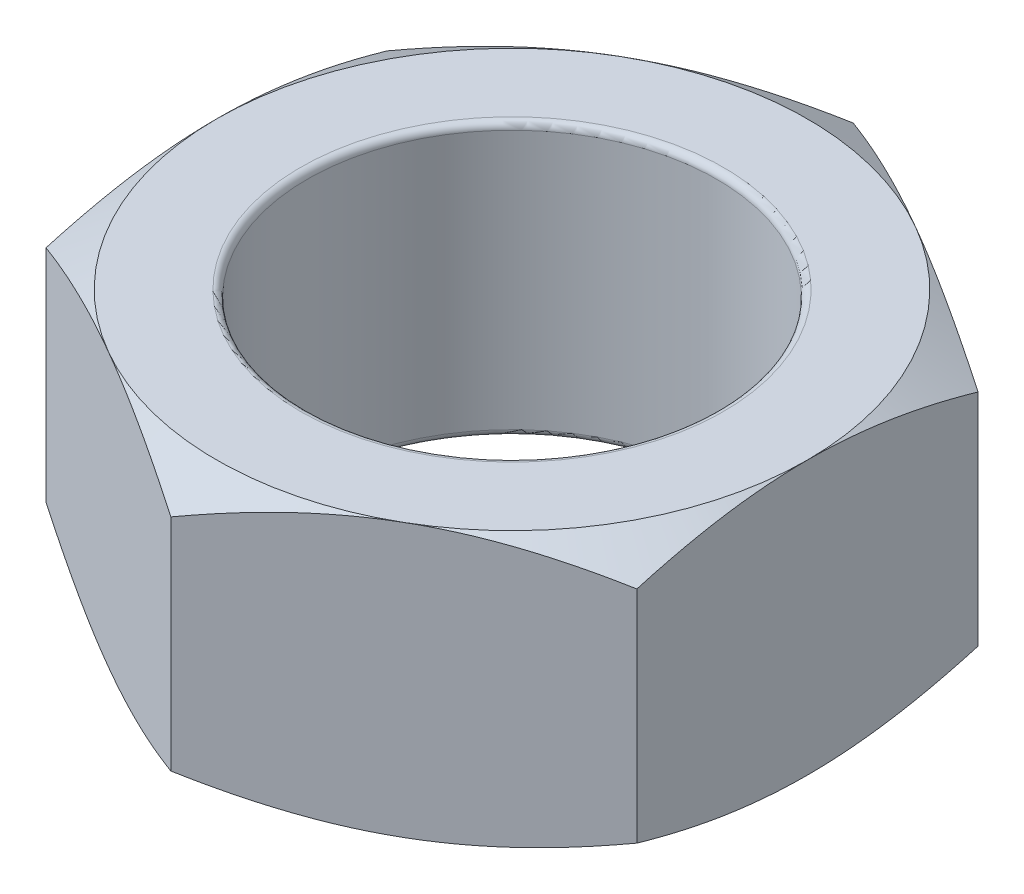
ISO-10303-21;
HEADER;
FILE_DESCRIPTION(('STEP AP214'),'2;1');
FILE_NAME('part.step','',(''),(''),'','','');
FILE_SCHEMA(('AUTOMOTIVE_DESIGN { 1 0 10303 214 1 1 1 1 }'));
ENDSEC;
DATA;
#1=APPLICATION_CONTEXT('core data for automotive mechanical design processes');
#2=APPLICATION_PROTOCOL_DEFINITION('international standard','automotive_design',2000,#1);
#3=PRODUCT_CONTEXT('',#1,'mechanical');
#4=PRODUCT('Part','Part','',(#3));
#5=PRODUCT_RELATED_PRODUCT_CATEGORY('part','',(#4));
#6=PRODUCT_DEFINITION_FORMATION('','',#4);
#7=PRODUCT_DEFINITION_CONTEXT('part definition',#1,'design');
#8=PRODUCT_DEFINITION('design','',#6,#7);
#9=PRODUCT_DEFINITION_SHAPE('','',#8);
#10=(LENGTH_UNIT() NAMED_UNIT(*) SI_UNIT(.MILLI.,.METRE.));
#11=(NAMED_UNIT(*) PLANE_ANGLE_UNIT() SI_UNIT($,.RADIAN.));
#12=(NAMED_UNIT(*) SI_UNIT($,.STERADIAN.) SOLID_ANGLE_UNIT());
#13=UNCERTAINTY_MEASURE_WITH_UNIT(LENGTH_MEASURE(1.E-05),#10,'distance_accuracy_value','');
#14=(GEOMETRIC_REPRESENTATION_CONTEXT(3) GLOBAL_UNCERTAINTY_ASSIGNED_CONTEXT((#13)) GLOBAL_UNIT_ASSIGNED_CONTEXT((#10,
#11,#12)) REPRESENTATION_CONTEXT('',''));
#15=CARTESIAN_POINT('',(0.,0.,0.));
#16=DIRECTION('',(0.,0.,1.));
#17=DIRECTION('',(1.,0.,0.));
#18=AXIS2_PLACEMENT_3D('',#15,#16,#17);
#19=CARTESIAN_POINT('',(2.1650635094611,2.,-1.25));
#20=DIRECTION('',(-0.5,0.,0.866025403784439));
#21=DIRECTION('',(0.866025403784439,0.,0.5));
#22=AXIS2_PLACEMENT_3D('',#19,#20,#21);
#23=PLANE('',#22);
#24=CARTESIAN_POINT('',(-0.0002,0.193442344259319,-2.50011547005384));
#25=CARTESIAN_POINT('',(0.0949448044588711,0.1617138656523,-2.44518359158751));
#26=CARTESIAN_POINT('',(0.190910890060669,0.132857638622771,-2.38977754623224));
#27=CARTESIAN_POINT('',(0.384504924957483,0.0824880415784608,-2.27800597807106));
#28=CARTESIAN_POINT('',(0.482136314962227,0.0609924917932504,-2.22163846877046));
#29=CARTESIAN_POINT('',(0.676189096729384,0.0275304926651335,-2.1096020429802));
#30=CARTESIAN_POINT('',(0.772580625603762,0.0153413537334431,-2.05395036783698));
#31=CARTESIAN_POINT('',(0.965817397426061,0.00078824708869799,-1.94238506560804));
#32=CARTESIAN_POINT('',(1.06266193768815,-0.0015877699378438,-1.88647184421818));
#33=CARTESIAN_POINT('',(1.24363193289309,0.00334676203409683,-1.78198876877136));
#34=CARTESIAN_POINT('',(1.32778443459629,0.00944571351687402,-1.73340329926004));
#35=CARTESIAN_POINT('',(1.49554116707323,0.0287784224945479,-1.63654890460611));
#36=CARTESIAN_POINT('',(1.57914481731117,0.0420187884503184,-1.588280314636));
#37=CARTESIAN_POINT('',(1.74724762493064,0.0751197068916932,-1.49122611340536));
#38=CARTESIAN_POINT('',(1.83172549874872,0.0951206177104666,-1.44245279021593));
#39=CARTESIAN_POINT('',(1.99942104705477,0.140515214481965,-1.34563372025953));
#40=CARTESIAN_POINT('',(2.08264087112059,0.165898229502511,-1.29758673243321));
#41=CARTESIAN_POINT('',(2.1652635094611,0.193442344259319,-1.24988452994616));
#42=B_SPLINE_CURVE_WITH_KNOTS('',3,(#24,#25,#26,#27,#28,#29,#30,#31,#32,#33,#34,#35,#36,#37,#38,
#39,#40,#41),.UNSPECIFIED.,.F.,.F.,(4,2,2,2,2,2,2,2,4),(0.,0.343195712322224,0.687216523785883,
1.02272234384044,1.3578160810825,1.64962474967976,1.94170391412719,2.24026314832885,
2.5382358827389),.UNSPECIFIED.);
#43=CARTESIAN_POINT('',(0.,0.193375672974063,-2.5));
#44=VERTEX_POINT('',#43);
#45=CARTESIAN_POINT('',(1.08253175473055,0.,-1.875));
#46=VERTEX_POINT('',#45);
#47=EDGE_CURVE('E69',#44,#46,#42,.T.);
#48=ORIENTED_EDGE('',*,*,#47,.F.);
#49=DIRECTION('',(0.,-1.,0.));
#50=VECTOR('',#49,1.);
#51=CARTESIAN_POINT('',(0.,2.,-2.5));
#52=LINE('',#51,#50);
#53=CARTESIAN_POINT('',(0.,1.80662432702594,-2.5));
#54=VERTEX_POINT('',#53);
#55=EDGE_CURVE('E353',#54,#44,#52,.T.);
#56=ORIENTED_EDGE('',*,*,#55,.F.);
#57=CARTESIAN_POINT('',(2.1652635094611,1.80655765574068,-1.24988452994616));
#58=CARTESIAN_POINT('',(2.07011870500222,1.8382861343477,-1.30481640841249));
#59=CARTESIAN_POINT('',(1.97415261940043,1.86714236137723,-1.36022245376776));
#60=CARTESIAN_POINT('',(1.78055858450361,1.91751195842154,-1.47199402192894));
#61=CARTESIAN_POINT('',(1.68292719449887,1.93900750820675,-1.52836153122954));
#62=CARTESIAN_POINT('',(1.48887441273171,1.97246950733487,-1.6403979570198));
#63=CARTESIAN_POINT('',(1.39248288385733,1.98465864626656,-1.69604963216302));
#64=CARTESIAN_POINT('',(1.19924611203504,1.9992117529113,-1.80761493439196));
#65=CARTESIAN_POINT('',(1.10240157177295,2.00158776993784,-1.86352815578182));
#66=CARTESIAN_POINT('',(0.921431576568005,1.9966532379659,-1.96801123122864));
#67=CARTESIAN_POINT('',(0.837279074864811,1.99055428648313,-2.01659670073996));
#68=CARTESIAN_POINT('',(0.669522342387871,1.97122157750545,-2.11345109539389));
#69=CARTESIAN_POINT('',(0.58591869214993,1.95798121154968,-2.161719685364));
#70=CARTESIAN_POINT('',(0.417815884530456,1.92488029310831,-2.25877388659464));
#71=CARTESIAN_POINT('',(0.333338010712378,1.90487938228953,-2.30754720978407));
#72=CARTESIAN_POINT('',(0.165642462406328,1.85948478551804,-2.40436627974047));
#73=CARTESIAN_POINT('',(0.0824226383405095,1.83410177049749,-2.45241326756679));
#74=CARTESIAN_POINT('',(-0.000200000000000003,1.80655765574068,-2.50011547005384));
#75=B_SPLINE_CURVE_WITH_KNOTS('',3,(#57,#58,#59,#60,#61,#62,#63,#64,#65,#66,#67,#68,#69,#70,#71,
#72,#73,#74),.UNSPECIFIED.,.F.,.F.,(4,2,2,2,2,2,2,2,4),(0.,0.343195712322224,0.687216523785883,
1.02272234384043,1.3578160810825,1.64962474967976,1.94170391412719,2.24026314832885,
2.5382358827389),.UNSPECIFIED.);
#76=CARTESIAN_POINT('',(1.08253175473055,2.,-1.875));
#77=VERTEX_POINT('',#76);
#78=EDGE_CURVE('E284',#77,#54,#75,.T.);
#79=ORIENTED_EDGE('',*,*,#78,.F.);
#80=CARTESIAN_POINT('',(2.1650635094611,1.80662432702594,-1.25));
#81=VERTEX_POINT('',#80);
#82=EDGE_CURVE('E372',#81,#77,#75,.T.);
#83=ORIENTED_EDGE('',*,*,#82,.F.);
#84=DIRECTION('',(0.,-1.,0.));
#85=VECTOR('',#84,1.);
#86=CARTESIAN_POINT('',(2.1650635094611,2.,-1.25));
#87=LINE('',#86,#85);
#88=CARTESIAN_POINT('',(2.1650635094611,0.193375672974063,-1.25));
#89=VERTEX_POINT('',#88);
#90=EDGE_CURVE('E369',#81,#89,#87,.T.);
#91=ORIENTED_EDGE('',*,*,#90,.T.);
#92=EDGE_CURVE('E157',#46,#89,#42,.T.);
#93=ORIENTED_EDGE('',*,*,#92,.F.);
#94=EDGE_LOOP('',(#48,#56,#79,#83,#91,#93));
#95=FACE_BOUND('',#94,.T.);
#96=ADVANCED_FACE('F53',(#95),#23,.F.);
#97=CARTESIAN_POINT('',(0.,2.,-2.5));
#98=DIRECTION('',(0.5,0.,0.866025403784439));
#99=DIRECTION('',(0.866025403784439,0.,-0.5));
#100=AXIS2_PLACEMENT_3D('',#97,#98,#99);
#101=PLANE('',#100);
#102=CARTESIAN_POINT('',(-2.1652635094611,0.193442344259319,-1.24988452994616));
#103=CARTESIAN_POINT('',(-2.07011870500223,0.161713865652301,-1.30481640841249));
#104=CARTESIAN_POINT('',(-1.97415261940043,0.132857638622771,-1.36022245376776));
#105=CARTESIAN_POINT('',(-1.78055858450361,0.082488041578461,-1.47199402192894));
#106=CARTESIAN_POINT('',(-1.68292719449887,0.0609924917932507,-1.52836153122954));
#107=CARTESIAN_POINT('',(-1.48887441273171,0.0275304926651338,-1.6403979570198));
#108=CARTESIAN_POINT('',(-1.39248288385734,0.0153413537334434,-1.69604963216302));
#109=CARTESIAN_POINT('',(-1.19924611203504,0.000788247088698008,-1.80761493439196));
#110=CARTESIAN_POINT('',(-1.10240157177295,-0.00158776993784397,-1.86352815578182));
#111=CARTESIAN_POINT('',(-0.921431576568005,0.0033467620340965,-1.96801123122864));
#112=CARTESIAN_POINT('',(-0.837279074864811,0.00944571351687369,-2.01659670073996));
#113=CARTESIAN_POINT('',(-0.669522342387871,0.0287784224945478,-2.11345109539389));
#114=CARTESIAN_POINT('',(-0.58591869214993,0.0420187884503185,-2.161719685364));
#115=CARTESIAN_POINT('',(-0.417815884530456,0.0751197068916934,-2.25877388659464));
#116=CARTESIAN_POINT('',(-0.333338010712378,0.0951206177104668,-2.30754720978407));
#117=CARTESIAN_POINT('',(-0.165642462406328,0.140515214481965,-2.40436627974047));
#118=CARTESIAN_POINT('',(-0.0824226383405096,0.165898229502511,-2.45241326756679));
#119=CARTESIAN_POINT('',(0.000200000000000077,0.193442344259319,-2.50011547005384));
#120=B_SPLINE_CURVE_WITH_KNOTS('',3,(#102,#103,#104,#105,#106,#107,#108,#109,#110,#111,#112,
#113,#114,#115,#116,#117,#118,#119),.UNSPECIFIED.,.F.,.F.,(4,2,2,2,2,2,2,2,4),(0.,
0.343195712322224,0.687216523785883,1.02272234384043,1.3578160810825,1.64962474967976,
1.94170391412719,2.24026314832885,2.5382358827389),.UNSPECIFIED.);
#121=CARTESIAN_POINT('',(-2.1650635094611,0.193375672974063,-1.25));
#122=VERTEX_POINT('',#121);
#123=CARTESIAN_POINT('',(-1.08253175473055,0.,-1.875));
#124=VERTEX_POINT('',#123);
#125=EDGE_CURVE('E77',#122,#124,#120,.T.);
#126=ORIENTED_EDGE('',*,*,#125,.F.);
#127=DIRECTION('',(0.,-1.,0.));
#128=VECTOR('',#127,1.);
#129=CARTESIAN_POINT('',(-2.1650635094611,2.,-1.25));
#130=LINE('',#129,#128);
#131=CARTESIAN_POINT('',(-2.1650635094611,1.80662432702594,-1.25));
#132=VERTEX_POINT('',#131);
#133=EDGE_CURVE('E357',#132,#122,#130,.T.);
#134=ORIENTED_EDGE('',*,*,#133,.F.);
#135=CARTESIAN_POINT('',(0.000200000000000046,1.80655765574068,-2.50011547005384));
#136=CARTESIAN_POINT('',(-0.0949448044588711,1.8382861343477,-2.44518359158751));
#137=CARTESIAN_POINT('',(-0.19091089006067,1.86714236137723,-2.38977754623224));
#138=CARTESIAN_POINT('',(-0.384504924957482,1.91751195842154,-2.27800597807106));
#139=CARTESIAN_POINT('',(-0.482136314962227,1.93900750820675,-2.22163846877046));
#140=CARTESIAN_POINT('',(-0.676189096729384,1.97246950733487,-2.1096020429802));
#141=CARTESIAN_POINT('',(-0.772580625603762,1.98465864626656,-2.05395036783698));
#142=CARTESIAN_POINT('',(-0.965817397426061,1.9992117529113,-1.94238506560804));
#143=CARTESIAN_POINT('',(-1.06266193768815,2.00158776993784,-1.88647184421818));
#144=CARTESIAN_POINT('',(-1.24363193289309,1.9966532379659,-1.78198876877136));
#145=CARTESIAN_POINT('',(-1.32778443459629,1.99055428648313,-1.73340329926004));
#146=CARTESIAN_POINT('',(-1.49554116707323,1.97122157750545,-1.63654890460611));
#147=CARTESIAN_POINT('',(-1.57914481731117,1.95798121154968,-1.588280314636));
#148=CARTESIAN_POINT('',(-1.74724762493064,1.92488029310831,-1.49122611340536));
#149=CARTESIAN_POINT('',(-1.83172549874872,1.90487938228953,-1.44245279021593));
#150=CARTESIAN_POINT('',(-1.99942104705477,1.85948478551803,-1.34563372025953));
#151=CARTESIAN_POINT('',(-2.08264087112059,1.83410177049749,-1.29758673243321));
#152=CARTESIAN_POINT('',(-2.1652635094611,1.80655765574068,-1.24988452994616));
#153=B_SPLINE_CURVE_WITH_KNOTS('',3,(#135,#136,#137,#138,#139,#140,#141,#142,#143,#144,#145,
#146,#147,#148,#149,#150,#151,#152),.UNSPECIFIED.,.F.,.F.,(4,2,2,2,2,2,2,2,4),(0.,
0.343195712322224,0.687216523785883,1.02272234384044,1.3578160810825,1.64962474967976,
1.94170391412719,2.24026314832885,2.5382358827389),.UNSPECIFIED.);
#154=CARTESIAN_POINT('',(-1.08253175473055,2.,-1.875));
#155=VERTEX_POINT('',#154);
#156=EDGE_CURVE('E276',#155,#132,#153,.T.);
#157=ORIENTED_EDGE('',*,*,#156,.F.);
#158=EDGE_CURVE('E283',#54,#155,#153,.T.);
#159=ORIENTED_EDGE('',*,*,#158,.F.);
#160=ORIENTED_EDGE('',*,*,#55,.T.);
#161=EDGE_CURVE('E189',#124,#44,#120,.T.);
#162=ORIENTED_EDGE('',*,*,#161,.F.);
#163=EDGE_LOOP('',(#126,#134,#157,#159,#160,#162));
#164=FACE_BOUND('',#163,.T.);
#165=ADVANCED_FACE('F290',(#164),#101,.F.);
#166=CARTESIAN_POINT('',(-2.1650635094611,2.,-1.25));
#167=DIRECTION('',(1.,0.,0.));
#168=DIRECTION('',(0.,0.,-1.));
#169=AXIS2_PLACEMENT_3D('',#166,#167,#168);
#170=PLANE('',#169);
#171=CARTESIAN_POINT('',(-2.1650635094611,1.57158759715785,4.38138901551839));
#172=CARTESIAN_POINT('',(-2.1650635094611,1.51898216705399,4.27974320635703));
#173=CARTESIAN_POINT('',(-2.1650635094611,1.46664938583593,4.17795510299244));
#174=CARTESIAN_POINT('',(-2.1650635094611,1.36266697294024,3.97402861616026));
#175=CARTESIAN_POINT('',(-2.1650635094611,1.31101735261765,3.87189022690588));
#176=CARTESIAN_POINT('',(-2.1650635094611,1.20846091361717,3.66704114189222));
#177=CARTESIAN_POINT('',(-2.1650635094611,1.15755537982374,3.56432980178112));
#178=CARTESIAN_POINT('',(-2.1650635094611,1.05675950176691,3.35840769205361));
#179=CARTESIAN_POINT('',(-2.1650635094611,1.00686917153464,3.25519691555886));
#180=CARTESIAN_POINT('',(-2.1650635094611,0.905690321368477,3.04258477583953));
#181=CARTESIAN_POINT('',(-2.1650635094611,0.85447174261452,2.93315003787373));
#182=CARTESIAN_POINT('',(-2.1650635094611,0.753821975604331,2.71346238246723));
#183=CARTESIAN_POINT('',(-2.1650635094611,0.704390741777129,2.60320948597319));
#184=CARTESIAN_POINT('',(-2.1650635094611,0.607869019421327,2.38176528384165));
#185=CARTESIAN_POINT('',(-2.1650635094611,0.560777004884744,2.27057464684206));
#186=CARTESIAN_POINT('',(-2.1650635094611,0.469607139158252,2.04692886953807));
#187=CARTESIAN_POINT('',(-2.1650635094611,0.425529959499213,1.93447345396755));
#188=CARTESIAN_POINT('',(-2.1650635094611,0.335244432967745,1.69155934507445));
#189=CARTESIAN_POINT('',(-2.1650635094611,0.289661432979877,1.56086506164026));
#190=CARTESIAN_POINT('',(-2.1650635094611,0.205801763783421,1.29717610461504));
#191=CARTESIAN_POINT('',(-2.1650635094611,0.167521536679473,1.16418258582886));
#192=CARTESIAN_POINT('',(-2.1650635094611,0.10158210570768,0.898294408619392));
#193=CARTESIAN_POINT('',(-2.1650635094611,0.0737293300501847,0.765448962486346));
#194=CARTESIAN_POINT('',(-2.1650635094611,0.0304722539571149,0.497720782983938));
#195=CARTESIAN_POINT('',(-2.1650635094611,0.0150605135229214,0.36283931643924));
#196=CARTESIAN_POINT('',(-2.1650635094611,0.00273414473692008,0.158863529890209));
#197=CARTESIAN_POINT('',(-2.1650635094611,0.000448741642451279,0.0900684443649398));
#198=CARTESIAN_POINT('',(-2.1650635094611,-0.000328212758942892,-0.0475481326546492));
#199=CARTESIAN_POINT('',(-2.1650635094611,0.00118022432327802,-0.116369624067511));
#200=CARTESIAN_POINT('',(-2.1650635094611,0.00793998799302336,-0.253836700442164));
#201=CARTESIAN_POINT('',(-2.1650635094611,0.0131919037603651,-0.322482256006683));
#202=CARTESIAN_POINT('',(-2.1650635094611,0.0272386710887365,-0.459414488352474));
#203=CARTESIAN_POINT('',(-2.1650635094611,0.0360341129373572,-0.527701103419812));
#204=CARTESIAN_POINT('',(-2.1650635094611,0.0677303113674984,-0.734598762742221));
#205=CARTESIAN_POINT('',(-2.1650635094611,0.0957841303305619,-0.872431714302955));
#206=CARTESIAN_POINT('',(-2.1650635094611,0.162356126579829,-1.14549125177638));
#207=CARTESIAN_POINT('',(-2.1650635094611,0.200878358141761,-1.28071680610369));
#208=CARTESIAN_POINT('',(-2.1650635094611,0.285281744249491,-1.54796786349162));
#209=CARTESIAN_POINT('',(-2.1650635094611,0.331119977213346,-1.68000715451591));
#210=CARTESIAN_POINT('',(-2.1650635094611,0.428206685133519,-1.94209594708301));
#211=CARTESIAN_POINT('',(-2.1650635094611,0.47945670864641,-2.07214486683654));
#212=CARTESIAN_POINT('',(-2.1650635094611,0.585918205173927,-2.33077403028862));
#213=CARTESIAN_POINT('',(-2.1650635094611,0.641134207602663,-2.45935239390318));
#214=CARTESIAN_POINT('',(-2.1650635094611,0.754436206976411,-2.71524001180105));
#215=CARTESIAN_POINT('',(-2.1650635094611,0.812522375481876,-2.8425491896725));
#216=CARTESIAN_POINT('',(-2.1650635094611,0.927308809324674,-3.08859963366269));
#217=CARTESIAN_POINT('',(-2.1650635094611,0.983885065772529,-3.20739899369662));
#218=CARTESIAN_POINT('',(-2.1650635094611,1.09850767575694,-3.44429024385032));
#219=CARTESIAN_POINT('',(-2.1650635094611,1.15655408400138,-3.56238210743963));
#220=CARTESIAN_POINT('',(-2.1650635094611,1.27358389507046,-3.79756228458607));
#221=CARTESIAN_POINT('',(-2.1650635094611,1.33256310942753,-3.91465268731236));
#222=CARTESIAN_POINT('',(-2.1650635094611,1.45143994155349,-4.14835324969922));
#223=CARTESIAN_POINT('',(-2.1650635094611,1.51133747496262,-4.2649634522388));
#224=CARTESIAN_POINT('',(-2.1650635094611,1.57158759715785,-4.38138901551839));
#225=B_SPLINE_CURVE_WITH_KNOTS('',3,(#171,#172,#173,#174,#175,#176,#177,#178,#179,#180,#181,
#182,#183,#184,#185,#186,#187,#188,#189,#190,#191,#192,#193,#194,#195,#196,#197,#198,#199,#200,
#201,#202,#203,#204,#205,#206,#207,#208,#209,#210,#211,#212,#213,#214,#215,#216,#217,#218,#219,
#220,#221,#222,#223,#224),.UNSPECIFIED.,.F.,.F.,(4,2,2,2,2,2,2,2,2,2,2,2,2,2,2,2,2,2,2,2,2,2,2,
2,2,2,4),(0.,0.343356393060417,0.686718486004802,1.03061638310587,1.37451902999478,
1.73698924938794,2.09945022054742,2.46167154560577,2.82397329164198,3.239068015015,
3.65395998574555,4.06071527591909,4.46722713736471,4.67363462237933,4.88004147569517,
5.08648082221389,5.29295457203617,5.71432413969706,6.13585713128455,6.55500229966534,
6.97426773100619,7.39401984791987,7.81379708539478,8.20853458715374,8.6032867996897,
8.99659958428232,9.38987645184433),.UNSPECIFIED.);
#226=CARTESIAN_POINT('',(-2.1650635094611,0.193375672974063,1.25));
#227=VERTEX_POINT('',#226);
#228=CARTESIAN_POINT('',(-2.1650635094611,0.,0.));
#229=VERTEX_POINT('',#228);
#230=EDGE_CURVE('E411',#227,#229,#225,.T.);
#231=ORIENTED_EDGE('',*,*,#230,.F.);
#232=DIRECTION('',(0.,-1.,0.));
#233=VECTOR('',#232,1.);
#234=CARTESIAN_POINT('',(-2.1650635094611,2.,1.25));
#235=LINE('',#234,#233);
#236=CARTESIAN_POINT('',(-2.1650635094611,1.80662432702594,1.25));
#237=VERTEX_POINT('',#236);
#238=EDGE_CURVE('E361',#237,#227,#235,.T.);
#239=ORIENTED_EDGE('',*,*,#238,.F.);
#240=CARTESIAN_POINT('',(-2.1650635094611,0.428412402842149,-4.38138901551839));
#241=CARTESIAN_POINT('',(-2.1650635094611,0.481017832946005,-4.27974320635703));
#242=CARTESIAN_POINT('',(-2.1650635094611,0.533350614164066,-4.17795510299245));
#243=CARTESIAN_POINT('',(-2.1650635094611,0.63733302705976,-3.97402861616026));
#244=CARTESIAN_POINT('',(-2.1650635094611,0.688982647382354,-3.87189022690588));
#245=CARTESIAN_POINT('',(-2.1650635094611,0.791539086382831,-3.66704114189222));
#246=CARTESIAN_POINT('',(-2.1650635094611,0.842444620176263,-3.56432980178112));
#247=CARTESIAN_POINT('',(-2.1650635094611,0.94324049823309,-3.35840769205361));
#248=CARTESIAN_POINT('',(-2.1650635094611,0.993130828465359,-3.25519691555886));
#249=CARTESIAN_POINT('',(-2.1650635094611,1.09430967863152,-3.04258477583953));
#250=CARTESIAN_POINT('',(-2.1650635094611,1.14552825738548,-2.93315003787373));
#251=CARTESIAN_POINT('',(-2.1650635094611,1.24617802439567,-2.71346238246723));
#252=CARTESIAN_POINT('',(-2.1650635094611,1.29560925822287,-2.6032094859732));
#253=CARTESIAN_POINT('',(-2.1650635094611,1.39213098057867,-2.38176528384165));
#254=CARTESIAN_POINT('',(-2.1650635094611,1.43922299511526,-2.27057464684206));
#255=CARTESIAN_POINT('',(-2.1650635094611,1.53039286084175,-2.04692886953808));
#256=CARTESIAN_POINT('',(-2.1650635094611,1.57447004050079,-1.93447345396755));
#257=CARTESIAN_POINT('',(-2.1650635094611,1.66475556703225,-1.69155934507445));
#258=CARTESIAN_POINT('',(-2.1650635094611,1.71033856702012,-1.56086506164027));
#259=CARTESIAN_POINT('',(-2.1650635094611,1.79419823621658,-1.29717610461504));
#260=CARTESIAN_POINT('',(-2.1650635094611,1.83247846332053,-1.16418258582886));
#261=CARTESIAN_POINT('',(-2.1650635094611,1.89841789429232,-0.898294408619392));
#262=CARTESIAN_POINT('',(-2.1650635094611,1.92627066994982,-0.765448962486346));
#263=CARTESIAN_POINT('',(-2.1650635094611,1.96952774604289,-0.497720782983938));
#264=CARTESIAN_POINT('',(-2.1650635094611,1.98493948647708,-0.36283931643924));
#265=CARTESIAN_POINT('',(-2.1650635094611,1.99726585526308,-0.158863529890209));
#266=CARTESIAN_POINT('',(-2.1650635094611,1.99955125835755,-0.0900684443649401));
#267=CARTESIAN_POINT('',(-2.1650635094611,2.00032821275894,0.0475481326546489));
#268=CARTESIAN_POINT('',(-2.1650635094611,1.99881977567672,0.116369624067511));
#269=CARTESIAN_POINT('',(-2.1650635094611,1.99206001200698,0.253836700442164));
#270=CARTESIAN_POINT('',(-2.1650635094611,1.98680809623963,0.322482256006683));
#271=CARTESIAN_POINT('',(-2.1650635094611,1.97276132891126,0.459414488352475));
#272=CARTESIAN_POINT('',(-2.1650635094611,1.96396588706264,0.527701103419813));
#273=CARTESIAN_POINT('',(-2.1650635094611,1.9322696886325,0.734598762742222));
#274=CARTESIAN_POINT('',(-2.1650635094611,1.90421586966944,0.872431714302956));
#275=CARTESIAN_POINT('',(-2.1650635094611,1.83764387342017,1.14549125177638));
#276=CARTESIAN_POINT('',(-2.1650635094611,1.79912164185824,1.28071680610369));
#277=CARTESIAN_POINT('',(-2.1650635094611,1.71471825575051,1.54796786349162));
#278=CARTESIAN_POINT('',(-2.1650635094611,1.66888002278665,1.68000715451591));
#279=CARTESIAN_POINT('',(-2.1650635094611,1.57179331486648,1.94209594708301));
#280=CARTESIAN_POINT('',(-2.1650635094611,1.52054329135359,2.07214486683654));
#281=CARTESIAN_POINT('',(-2.1650635094611,1.41408179482607,2.33077403028862));
#282=CARTESIAN_POINT('',(-2.1650635094611,1.35886579239734,2.45935239390318));
#283=CARTESIAN_POINT('',(-2.1650635094611,1.24556379302359,2.71524001180105));
#284=CARTESIAN_POINT('',(-2.1650635094611,1.18747762451812,2.8425491896725));
#285=CARTESIAN_POINT('',(-2.1650635094611,1.07269119067533,3.08859963366269));
#286=CARTESIAN_POINT('',(-2.1650635094611,1.01611493422747,3.20739899369662));
#287=CARTESIAN_POINT('',(-2.1650635094611,0.901492324243062,3.44429024385032));
#288=CARTESIAN_POINT('',(-2.1650635094611,0.843445915998622,3.56238210743963));
#289=CARTESIAN_POINT('',(-2.1650635094611,0.726416104929538,3.79756228458607));
#290=CARTESIAN_POINT('',(-2.1650635094611,0.667436890572474,3.91465268731236));
#291=CARTESIAN_POINT('',(-2.1650635094611,0.548560058446516,4.14835324969922));
#292=CARTESIAN_POINT('',(-2.1650635094611,0.488662525037377,4.2649634522388));
#293=CARTESIAN_POINT('',(-2.1650635094611,0.42841240284215,4.38138901551839));
#294=B_SPLINE_CURVE_WITH_KNOTS('',3,(#240,#241,#242,#243,#244,#245,#246,#247,#248,#249,#250,
#251,#252,#253,#254,#255,#256,#257,#258,#259,#260,#261,#262,#263,#264,#265,#266,#267,#268,#269,
#270,#271,#272,#273,#274,#275,#276,#277,#278,#279,#280,#281,#282,#283,#284,#285,#286,#287,#288,
#289,#290,#291,#292,#293),.UNSPECIFIED.,.F.,.F.,(4,2,2,2,2,2,2,2,2,2,2,2,2,2,2,2,2,2,2,2,2,2,2,
2,2,2,4),(0.,0.343356393060417,0.686718486004802,1.03061638310587,1.37451902999478,
1.73698924938794,2.09945022054742,2.46167154560577,2.82397329164198,3.239068015015,
3.65395998574555,4.0607152759191,4.46722713736471,4.67363462237933,4.88004147569517,
5.08648082221389,5.29295457203617,5.71432413969706,6.13585713128455,6.55500229966534,
6.97426773100619,7.39401984791987,7.81379708539478,8.20853458715374,8.6032867996897,
8.99659958428232,9.38987645184433),.UNSPECIFIED.);
#295=CARTESIAN_POINT('',(-2.1650635094611,2.,0.));
#296=VERTEX_POINT('',#295);
#297=EDGE_CURVE('E268',#296,#237,#294,.T.);
#298=ORIENTED_EDGE('',*,*,#297,.F.);
#299=EDGE_CURVE('E275',#132,#296,#294,.T.);
#300=ORIENTED_EDGE('',*,*,#299,.F.);
#301=ORIENTED_EDGE('',*,*,#133,.T.);
#302=EDGE_CURVE('E225',#229,#122,#225,.T.);
#303=ORIENTED_EDGE('',*,*,#302,.F.);
#304=EDGE_LOOP('',(#231,#239,#298,#300,#301,#303));
#305=FACE_BOUND('',#304,.T.);
#306=ADVANCED_FACE('F248',(#305),#170,.F.);
#307=CARTESIAN_POINT('',(-2.1650635094611,2.,1.25));
#308=DIRECTION('',(0.5,0.,-0.866025403784439));
#309=DIRECTION('',(-0.866025403784439,0.,-0.5));
#310=AXIS2_PLACEMENT_3D('',#307,#308,#309);
#311=PLANE('',#310);
#312=CARTESIAN_POINT('',(0.000199999999999621,0.193442344259319,2.50011547005384));
#313=CARTESIAN_POINT('',(-0.0949448044588714,0.1617138656523,2.44518359158751));
#314=CARTESIAN_POINT('',(-0.19091089006067,0.132857638622771,2.38977754623224));
#315=CARTESIAN_POINT('',(-0.384504924957483,0.0824880415784607,2.27800597807106));
#316=CARTESIAN_POINT('',(-0.482136314962227,0.0609924917932503,2.22163846877046));
#317=CARTESIAN_POINT('',(-0.676189096729385,0.0275304926651333,2.1096020429802));
#318=CARTESIAN_POINT('',(-0.772580625603762,0.015341353733443,2.05395036783698));
#319=CARTESIAN_POINT('',(-0.965817397426061,0.000788247088697785,1.94238506560804));
#320=CARTESIAN_POINT('',(-1.06266193768815,-0.00158776993784406,1.88647184421818));
#321=CARTESIAN_POINT('',(-1.24363193289309,0.00334676203409659,1.78198876877136));
#322=CARTESIAN_POINT('',(-1.32778443459629,0.00944571351687383,1.73340329926004));
#323=CARTESIAN_POINT('',(-1.49554116707323,0.0287784224945477,1.63654890460611));
#324=CARTESIAN_POINT('',(-1.57914481731117,0.0420187884503182,1.588280314636));
#325=CARTESIAN_POINT('',(-1.74724762493064,0.0751197068916929,1.49122611340536));
#326=CARTESIAN_POINT('',(-1.83172549874872,0.0951206177104664,1.44245279021593));
#327=CARTESIAN_POINT('',(-1.99942104705477,0.140515214481965,1.34563372025953));
#328=CARTESIAN_POINT('',(-2.08264087112059,0.165898229502511,1.29758673243321));
#329=CARTESIAN_POINT('',(-2.1652635094611,0.193442344259318,1.24988452994616));
#330=B_SPLINE_CURVE_WITH_KNOTS('',3,(#312,#313,#314,#315,#316,#317,#318,#319,#320,#321,#322,
#323,#324,#325,#326,#327,#328,#329),.UNSPECIFIED.,.F.,.F.,(4,2,2,2,2,2,2,2,4),(0.,
0.343195712322224,0.687216523785883,1.02272234384043,1.3578160810825,1.64962474967976,
1.94170391412719,2.24026314832885,2.5382358827389),.UNSPECIFIED.);
#331=CARTESIAN_POINT('',(0.,0.193375672974063,2.5));
#332=VERTEX_POINT('',#331);
#333=CARTESIAN_POINT('',(-1.08253175473055,0.,1.875));
#334=VERTEX_POINT('',#333);
#335=EDGE_CURVE('E167',#332,#334,#330,.T.);
#336=ORIENTED_EDGE('',*,*,#335,.F.);
#337=DIRECTION('',(0.,-1.,0.));
#338=VECTOR('',#337,1.);
#339=CARTESIAN_POINT('',(0.,2.,2.5));
#340=LINE('',#339,#338);
#341=CARTESIAN_POINT('',(0.,1.80662432702594,2.5));
#342=VERTEX_POINT('',#341);
#343=EDGE_CURVE('E185',#342,#332,#340,.T.);
#344=ORIENTED_EDGE('',*,*,#343,.F.);
#345=CARTESIAN_POINT('',(-2.1652635094611,1.80655765574068,1.24988452994616));
#346=CARTESIAN_POINT('',(-2.07011870500222,1.8382861343477,1.30481640841249));
#347=CARTESIAN_POINT('',(-1.97415261940043,1.86714236137723,1.36022245376776));
#348=CARTESIAN_POINT('',(-1.78055858450361,1.91751195842154,1.47199402192894));
#349=CARTESIAN_POINT('',(-1.68292719449887,1.93900750820675,1.52836153122954));
#350=CARTESIAN_POINT('',(-1.48887441273171,1.97246950733487,1.6403979570198));
#351=CARTESIAN_POINT('',(-1.39248288385733,1.98465864626656,1.69604963216302));
#352=CARTESIAN_POINT('',(-1.19924611203504,1.9992117529113,1.80761493439196));
#353=CARTESIAN_POINT('',(-1.10240157177295,2.00158776993784,1.86352815578182));
#354=CARTESIAN_POINT('',(-0.921431576568005,1.9966532379659,1.96801123122864));
#355=CARTESIAN_POINT('',(-0.837279074864811,1.99055428648313,2.01659670073996));
#356=CARTESIAN_POINT('',(-0.669522342387871,1.97122157750545,2.11345109539389));
#357=CARTESIAN_POINT('',(-0.58591869214993,1.95798121154968,2.161719685364));
#358=CARTESIAN_POINT('',(-0.417815884530457,1.92488029310831,2.25877388659464));
#359=CARTESIAN_POINT('',(-0.333338010712378,1.90487938228953,2.30754720978407));
#360=CARTESIAN_POINT('',(-0.165642462406328,1.85948478551803,2.40436627974047));
#361=CARTESIAN_POINT('',(-0.0824226383405099,1.83410177049749,2.45241326756679));
#362=CARTESIAN_POINT('',(0.000199999999999443,1.80655765574068,2.50011547005384));
#363=B_SPLINE_CURVE_WITH_KNOTS('',3,(#345,#346,#347,#348,#349,#350,#351,#352,#353,#354,#355,
#356,#357,#358,#359,#360,#361,#362),.UNSPECIFIED.,.F.,.F.,(4,2,2,2,2,2,2,2,4),(0.,
0.343195712322224,0.687216523785884,1.02272234384044,1.3578160810825,1.64962474967976,
1.94170391412719,2.24026314832885,2.5382358827389),.UNSPECIFIED.);
#364=CARTESIAN_POINT('',(-1.08253175473055,2.,1.875));
#365=VERTEX_POINT('',#364);
#366=EDGE_CURVE('E253',#365,#342,#363,.T.);
#367=ORIENTED_EDGE('',*,*,#366,.F.);
#368=EDGE_CURVE('E261',#237,#365,#363,.T.);
#369=ORIENTED_EDGE('',*,*,#368,.F.);
#370=ORIENTED_EDGE('',*,*,#238,.T.);
#371=EDGE_CURVE('E191',#334,#227,#330,.T.);
#372=ORIENTED_EDGE('',*,*,#371,.F.);
#373=EDGE_LOOP('',(#336,#344,#367,#369,#370,#372));
#374=FACE_BOUND('',#373,.T.);
#375=ADVANCED_FACE('F245',(#374),#311,.F.);
#376=CARTESIAN_POINT('',(0.,2.,2.5));
#377=DIRECTION('',(-0.5,0.,-0.866025403784439));
#378=DIRECTION('',(-0.866025403784439,0.,0.5));
#379=AXIS2_PLACEMENT_3D('',#376,#377,#378);
#380=PLANE('',#379);
#381=CARTESIAN_POINT('',(2.1652635094611,0.193442344259319,1.24988452994616));
#382=CARTESIAN_POINT('',(2.07011870500223,0.1617138656523,1.30481640841249));
#383=CARTESIAN_POINT('',(1.97415261940043,0.132857638622771,1.36022245376776));
#384=CARTESIAN_POINT('',(1.78055858450361,0.0824880415784607,1.47199402192894));
#385=CARTESIAN_POINT('',(1.68292719449887,0.0609924917932504,1.52836153122954));
#386=CARTESIAN_POINT('',(1.48887441273171,0.0275304926651334,1.6403979570198));
#387=CARTESIAN_POINT('',(1.39248288385734,0.015341353733443,1.69604963216302));
#388=CARTESIAN_POINT('',(1.19924611203504,0.000788247088697659,1.80761493439196));
#389=CARTESIAN_POINT('',(1.10240157177295,-0.00158776993784421,1.86352815578182));
#390=CARTESIAN_POINT('',(0.921431576568005,0.00334676203409648,1.96801123122864));
#391=CARTESIAN_POINT('',(0.837279074864811,0.0094457135168738,2.01659670073996));
#392=CARTESIAN_POINT('',(0.669522342387871,0.0287784224945479,2.11345109539389));
#393=CARTESIAN_POINT('',(0.58591869214993,0.0420187884503184,2.161719685364));
#394=CARTESIAN_POINT('',(0.417815884530456,0.0751197068916933,2.25877388659464));
#395=CARTESIAN_POINT('',(0.333338010712378,0.0951206177104667,2.30754720978407));
#396=CARTESIAN_POINT('',(0.165642462406327,0.140515214481965,2.40436627974047));
#397=CARTESIAN_POINT('',(0.0824226383405088,0.165898229502511,2.45241326756679));
#398=CARTESIAN_POINT('',(-0.00020000000000061,0.193442344259319,2.50011547005384));
#399=B_SPLINE_CURVE_WITH_KNOTS('',3,(#381,#382,#383,#384,#385,#386,#387,#388,#389,#390,#391,
#392,#393,#394,#395,#396,#397,#398),.UNSPECIFIED.,.F.,.F.,(4,2,2,2,2,2,2,2,4),(0.,
0.343195712322224,0.687216523785883,1.02272234384044,1.3578160810825,1.64962474967976,
1.94170391412719,2.24026314832885,2.5382358827389),.UNSPECIFIED.);
#400=CARTESIAN_POINT('',(2.1650635094611,0.193375672974061,1.25));
#401=VERTEX_POINT('',#400);
#402=CARTESIAN_POINT('',(1.08253175473055,0.,1.875));
#403=VERTEX_POINT('',#402);
#404=EDGE_CURVE('E144',#401,#403,#399,.T.);
#405=ORIENTED_EDGE('',*,*,#404,.F.);
#406=DIRECTION('',(0.,-1.,0.));
#407=VECTOR('',#406,1.);
#408=CARTESIAN_POINT('',(2.1650635094611,2.,1.25));
#409=LINE('',#408,#407);
#410=CARTESIAN_POINT('',(2.1650635094611,1.80662432702594,1.25));
#411=VERTEX_POINT('',#410);
#412=EDGE_CURVE('E367',#411,#401,#409,.T.);
#413=ORIENTED_EDGE('',*,*,#412,.F.);
#414=CARTESIAN_POINT('',(-0.000200000000000425,1.80655765574068,2.50011547005384));
#415=CARTESIAN_POINT('',(0.0949448044588708,1.8382861343477,2.44518359158751));
#416=CARTESIAN_POINT('',(0.190910890060669,1.86714236137723,2.38977754623224));
#417=CARTESIAN_POINT('',(0.384504924957482,1.91751195842154,2.27800597807106));
#418=CARTESIAN_POINT('',(0.482136314962227,1.93900750820675,2.22163846877046));
#419=CARTESIAN_POINT('',(0.676189096729384,1.97246950733487,2.1096020429802));
#420=CARTESIAN_POINT('',(0.772580625603762,1.98465864626656,2.05395036783698));
#421=CARTESIAN_POINT('',(0.965817397426061,1.9992117529113,1.94238506560804));
#422=CARTESIAN_POINT('',(1.06266193768815,2.00158776993784,1.88647184421818));
#423=CARTESIAN_POINT('',(1.24363193289309,1.9966532379659,1.78198876877136));
#424=CARTESIAN_POINT('',(1.32778443459629,1.99055428648313,1.73340329926004));
#425=CARTESIAN_POINT('',(1.49554116707323,1.97122157750545,1.63654890460611));
#426=CARTESIAN_POINT('',(1.57914481731117,1.95798121154968,1.588280314636));
#427=CARTESIAN_POINT('',(1.74724762493064,1.92488029310831,1.49122611340536));
#428=CARTESIAN_POINT('',(1.83172549874872,1.90487938228953,1.44245279021593));
#429=CARTESIAN_POINT('',(1.99942104705477,1.85948478551803,1.34563372025953));
#430=CARTESIAN_POINT('',(2.08264087112059,1.83410177049749,1.29758673243321));
#431=CARTESIAN_POINT('',(2.1652635094611,1.80655765574068,1.24988452994616));
#432=B_SPLINE_CURVE_WITH_KNOTS('',3,(#414,#415,#416,#417,#418,#419,#420,#421,#422,#423,#424,
#425,#426,#427,#428,#429,#430,#431),.UNSPECIFIED.,.F.,.F.,(4,2,2,2,2,2,2,2,4),(0.,
0.343195712322224,0.687216523785883,1.02272234384044,1.3578160810825,1.64962474967976,
1.94170391412719,2.24026314832885,2.5382358827389),.UNSPECIFIED.);
#433=CARTESIAN_POINT('',(1.08253175473055,2.,1.875));
#434=VERTEX_POINT('',#433);
#435=EDGE_CURVE('E263',#434,#411,#432,.T.);
#436=ORIENTED_EDGE('',*,*,#435,.F.);
#437=EDGE_CURVE('E262',#342,#434,#432,.T.);
#438=ORIENTED_EDGE('',*,*,#437,.F.);
#439=ORIENTED_EDGE('',*,*,#343,.T.);
#440=EDGE_CURVE('E160',#403,#332,#399,.T.);
#441=ORIENTED_EDGE('',*,*,#440,.F.);
#442=EDGE_LOOP('',(#405,#413,#436,#438,#439,#441));
#443=FACE_BOUND('',#442,.T.);
#444=ADVANCED_FACE('F182',(#443),#380,.F.);
#445=CARTESIAN_POINT('',(2.1650635094611,2.,1.25));
#446=DIRECTION('',(-1.,0.,0.));
#447=DIRECTION('',(0.,0.,1.));
#448=AXIS2_PLACEMENT_3D('',#445,#446,#447);
#449=PLANE('',#448);
#450=CARTESIAN_POINT('',(2.1650635094611,1.57158759715785,-4.38138901551839));
#451=CARTESIAN_POINT('',(2.1650635094611,1.518982167054,-4.27974320635703));
#452=CARTESIAN_POINT('',(2.1650635094611,1.46664938583593,-4.17795510299245));
#453=CARTESIAN_POINT('',(2.1650635094611,1.36266697294024,-3.97402861616026));
#454=CARTESIAN_POINT('',(2.1650635094611,1.31101735261765,-3.87189022690588));
#455=CARTESIAN_POINT('',(2.1650635094611,1.20846091361717,-3.66704114189222));
#456=CARTESIAN_POINT('',(2.1650635094611,1.15755537982374,-3.56432980178112));
#457=CARTESIAN_POINT('',(2.1650635094611,1.05675950176691,-3.35840769205361));
#458=CARTESIAN_POINT('',(2.1650635094611,1.00686917153464,-3.25519691555886));
#459=CARTESIAN_POINT('',(2.1650635094611,0.905690321368477,-3.04258477583953));
#460=CARTESIAN_POINT('',(2.1650635094611,0.854471742614521,-2.93315003787373));
#461=CARTESIAN_POINT('',(2.1650635094611,0.753821975604332,-2.71346238246723));
#462=CARTESIAN_POINT('',(2.1650635094611,0.70439074177713,-2.6032094859732));
#463=CARTESIAN_POINT('',(2.1650635094611,0.607869019421328,-2.38176528384165));
#464=CARTESIAN_POINT('',(2.1650635094611,0.560777004884744,-2.27057464684206));
#465=CARTESIAN_POINT('',(2.1650635094611,0.469607139158253,-2.04692886953808));
#466=CARTESIAN_POINT('',(2.1650635094611,0.425529959499214,-1.93447345396755));
#467=CARTESIAN_POINT('',(2.1650635094611,0.335244432967745,-1.69155934507445));
#468=CARTESIAN_POINT('',(2.1650635094611,0.289661432979877,-1.56086506164027));
#469=CARTESIAN_POINT('',(2.1650635094611,0.205801763783421,-1.29717610461504));
#470=CARTESIAN_POINT('',(2.1650635094611,0.167521536679474,-1.16418258582886));
#471=CARTESIAN_POINT('',(2.1650635094611,0.10158210570768,-0.898294408619393));
#472=CARTESIAN_POINT('',(2.1650635094611,0.073729330050185,-0.765448962486347));
#473=CARTESIAN_POINT('',(2.1650635094611,0.0304722539571152,-0.497720782983939));
#474=CARTESIAN_POINT('',(2.1650635094611,0.0150605135229215,-0.362839316439241));
#475=CARTESIAN_POINT('',(2.1650635094611,0.00273414473692005,-0.15886352989021));
#476=CARTESIAN_POINT('',(2.1650635094611,0.000448741642451268,-0.0900684443649411));
#477=CARTESIAN_POINT('',(2.1650635094611,-0.000328212758942881,0.047548132654648));
#478=CARTESIAN_POINT('',(2.1650635094611,0.00118022432327804,0.11636962406751));
#479=CARTESIAN_POINT('',(2.1650635094611,0.00793998799302335,0.253836700442162));
#480=CARTESIAN_POINT('',(2.1650635094611,0.0131919037603651,0.322482256006682));
#481=CARTESIAN_POINT('',(2.1650635094611,0.0272386710887365,0.459414488352474));
#482=CARTESIAN_POINT('',(2.1650635094611,0.0360341129373572,0.527701103419812));
#483=CARTESIAN_POINT('',(2.1650635094611,0.0677303113674984,0.734598762742221));
#484=CARTESIAN_POINT('',(2.1650635094611,0.0957841303305619,0.872431714302956));
#485=CARTESIAN_POINT('',(2.1650635094611,0.162356126579829,1.14549125177638));
#486=CARTESIAN_POINT('',(2.1650635094611,0.200878358141761,1.28071680610369));
#487=CARTESIAN_POINT('',(2.1650635094611,0.285281744249491,1.54796786349162));
#488=CARTESIAN_POINT('',(2.1650635094611,0.331119977213346,1.68000715451591));
#489=CARTESIAN_POINT('',(2.1650635094611,0.428206685133519,1.94209594708302));
#490=CARTESIAN_POINT('',(2.1650635094611,0.479456708646411,2.07214486683654));
#491=CARTESIAN_POINT('',(2.1650635094611,0.585918205173927,2.33077403028862));
#492=CARTESIAN_POINT('',(2.1650635094611,0.641134207602663,2.45935239390318));
#493=CARTESIAN_POINT('',(2.1650635094611,0.754436206976412,2.71524001180106));
#494=CARTESIAN_POINT('',(2.1650635094611,0.812522375481876,2.8425491896725));
#495=CARTESIAN_POINT('',(2.1650635094611,0.927308809324674,3.08859963366269));
#496=CARTESIAN_POINT('',(2.1650635094611,0.983885065772529,3.20739899369662));
#497=CARTESIAN_POINT('',(2.1650635094611,1.09850767575694,3.44429024385032));
#498=CARTESIAN_POINT('',(2.1650635094611,1.15655408400138,3.56238210743963));
#499=CARTESIAN_POINT('',(2.1650635094611,1.27358389507046,3.79756228458607));
#500=CARTESIAN_POINT('',(2.1650635094611,1.33256310942753,3.91465268731236));
#501=CARTESIAN_POINT('',(2.1650635094611,1.45143994155349,4.14835324969922));
#502=CARTESIAN_POINT('',(2.1650635094611,1.51133747496262,4.2649634522388));
#503=CARTESIAN_POINT('',(2.1650635094611,1.57158759715785,4.38138901551839));
#504=B_SPLINE_CURVE_WITH_KNOTS('',3,(#450,#451,#452,#453,#454,#455,#456,#457,#458,#459,#460,
#461,#462,#463,#464,#465,#466,#467,#468,#469,#470,#471,#472,#473,#474,#475,#476,#477,#478,#479,
#480,#481,#482,#483,#484,#485,#486,#487,#488,#489,#490,#491,#492,#493,#494,#495,#496,#497,#498,
#499,#500,#501,#502,#503),.UNSPECIFIED.,.F.,.F.,(4,2,2,2,2,2,2,2,2,2,2,2,2,2,2,2,2,2,2,2,2,2,2,
2,2,2,4),(0.,0.343356393060418,0.686718486004802,1.03061638310587,1.37451902999478,
1.73698924938794,2.09945022054742,2.46167154560577,2.82397329164198,3.239068015015,
3.65395998574555,4.0607152759191,4.46722713736471,4.67363462237933,4.88004147569517,
5.08648082221389,5.29295457203617,5.71432413969706,6.13585713128455,6.55500229966534,
6.97426773100619,7.39401984791987,7.81379708539478,8.20853458715374,8.6032867996897,
8.99659958428232,9.38987645184434),.UNSPECIFIED.);
#505=CARTESIAN_POINT('',(2.1650635094611,0.,0.));
#506=VERTEX_POINT('',#505);
#507=EDGE_CURVE('E158',#89,#506,#504,.T.);
#508=ORIENTED_EDGE('',*,*,#507,.F.);
#509=ORIENTED_EDGE('',*,*,#90,.F.);
#510=CARTESIAN_POINT('',(2.1650635094611,0.428412402842149,4.38138901551839));
#511=CARTESIAN_POINT('',(2.1650635094611,0.481017832946005,4.27974320635703));
#512=CARTESIAN_POINT('',(2.1650635094611,0.533350614164066,4.17795510299245));
#513=CARTESIAN_POINT('',(2.1650635094611,0.63733302705976,3.97402861616026));
#514=CARTESIAN_POINT('',(2.1650635094611,0.688982647382354,3.87189022690588));
#515=CARTESIAN_POINT('',(2.1650635094611,0.791539086382831,3.66704114189222));
#516=CARTESIAN_POINT('',(2.1650635094611,0.842444620176263,3.56432980178112));
#517=CARTESIAN_POINT('',(2.1650635094611,0.94324049823309,3.35840769205361));
#518=CARTESIAN_POINT('',(2.1650635094611,0.993130828465359,3.25519691555886));
#519=CARTESIAN_POINT('',(2.1650635094611,1.09430967863152,3.04258477583953));
#520=CARTESIAN_POINT('',(2.1650635094611,1.14552825738548,2.93315003787373));
#521=CARTESIAN_POINT('',(2.1650635094611,1.24617802439567,2.71346238246723));
#522=CARTESIAN_POINT('',(2.1650635094611,1.29560925822287,2.6032094859732));
#523=CARTESIAN_POINT('',(2.1650635094611,1.39213098057867,2.38176528384165));
#524=CARTESIAN_POINT('',(2.1650635094611,1.43922299511526,2.27057464684206));
#525=CARTESIAN_POINT('',(2.1650635094611,1.53039286084175,2.04692886953808));
#526=CARTESIAN_POINT('',(2.1650635094611,1.57447004050079,1.93447345396755));
#527=CARTESIAN_POINT('',(2.1650635094611,1.66475556703225,1.69155934507445));
#528=CARTESIAN_POINT('',(2.1650635094611,1.71033856702012,1.56086506164027));
#529=CARTESIAN_POINT('',(2.1650635094611,1.79419823621658,1.29717610461504));
#530=CARTESIAN_POINT('',(2.1650635094611,1.83247846332053,1.16418258582886));
#531=CARTESIAN_POINT('',(2.1650635094611,1.89841789429232,0.898294408619392));
#532=CARTESIAN_POINT('',(2.1650635094611,1.92627066994982,0.765448962486346));
#533=CARTESIAN_POINT('',(2.1650635094611,1.96952774604289,0.497720782983938));
#534=CARTESIAN_POINT('',(2.1650635094611,1.98493948647708,0.36283931643924));
#535=CARTESIAN_POINT('',(2.1650635094611,1.99726585526308,0.158863529890209));
#536=CARTESIAN_POINT('',(2.1650635094611,1.99955125835755,0.0900684443649401));
#537=CARTESIAN_POINT('',(2.1650635094611,2.00032821275894,-0.0475481326546489));
#538=CARTESIAN_POINT('',(2.1650635094611,1.99881977567672,-0.116369624067511));
#539=CARTESIAN_POINT('',(2.1650635094611,1.99206001200698,-0.253836700442163));
#540=CARTESIAN_POINT('',(2.1650635094611,1.98680809623963,-0.322482256006683));
#541=CARTESIAN_POINT('',(2.1650635094611,1.97276132891126,-0.459414488352475));
#542=CARTESIAN_POINT('',(2.1650635094611,1.96396588706264,-0.527701103419812));
#543=CARTESIAN_POINT('',(2.1650635094611,1.9322696886325,-0.734598762742222));
#544=CARTESIAN_POINT('',(2.1650635094611,1.90421586966944,-0.872431714302956));
#545=CARTESIAN_POINT('',(2.1650635094611,1.83764387342017,-1.14549125177638));
#546=CARTESIAN_POINT('',(2.1650635094611,1.79912164185824,-1.28071680610369));
#547=CARTESIAN_POINT('',(2.1650635094611,1.71471825575051,-1.54796786349162));
#548=CARTESIAN_POINT('',(2.1650635094611,1.66888002278665,-1.68000715451591));
#549=CARTESIAN_POINT('',(2.1650635094611,1.57179331486648,-1.94209594708302));
#550=CARTESIAN_POINT('',(2.1650635094611,1.52054329135359,-2.07214486683654));
#551=CARTESIAN_POINT('',(2.1650635094611,1.41408179482607,-2.33077403028862));
#552=CARTESIAN_POINT('',(2.1650635094611,1.35886579239734,-2.45935239390319));
#553=CARTESIAN_POINT('',(2.1650635094611,1.24556379302359,-2.71524001180106));
#554=CARTESIAN_POINT('',(2.1650635094611,1.18747762451812,-2.8425491896725));
#555=CARTESIAN_POINT('',(2.1650635094611,1.07269119067533,-3.08859963366269));
#556=CARTESIAN_POINT('',(2.1650635094611,1.01611493422747,-3.20739899369663));
#557=CARTESIAN_POINT('',(2.1650635094611,0.90149232424306,-3.44429024385032));
#558=CARTESIAN_POINT('',(2.1650635094611,0.843445915998621,-3.56238210743963));
#559=CARTESIAN_POINT('',(2.1650635094611,0.726416104929537,-3.79756228458607));
#560=CARTESIAN_POINT('',(2.1650635094611,0.667436890572472,-3.91465268731236));
#561=CARTESIAN_POINT('',(2.1650635094611,0.548560058446514,-4.14835324969922));
#562=CARTESIAN_POINT('',(2.1650635094611,0.488662525037376,-4.2649634522388));
#563=CARTESIAN_POINT('',(2.1650635094611,0.428412402842149,-4.38138901551839));
#564=B_SPLINE_CURVE_WITH_KNOTS('',3,(#510,#511,#512,#513,#514,#515,#516,#517,#518,#519,#520,
#521,#522,#523,#524,#525,#526,#527,#528,#529,#530,#531,#532,#533,#534,#535,#536,#537,#538,#539,
#540,#541,#542,#543,#544,#545,#546,#547,#548,#549,#550,#551,#552,#553,#554,#555,#556,#557,#558,
#559,#560,#561,#562,#563),.UNSPECIFIED.,.F.,.F.,(4,2,2,2,2,2,2,2,2,2,2,2,2,2,2,2,2,2,2,2,2,2,2,
2,2,2,4),(0.,0.343356393060417,0.686718486004802,1.03061638310587,1.37451902999478,
1.73698924938794,2.09945022054742,2.46167154560577,2.82397329164198,3.239068015015,
3.65395998574555,4.0607152759191,4.46722713736471,4.67363462237933,4.88004147569517,
5.08648082221389,5.29295457203617,5.71432413969706,6.13585713128455,6.55500229966534,
6.97426773100619,7.39401984791987,7.81379708539478,8.20853458715374,8.6032867996897,
8.99659958428232,9.38987645184433),.UNSPECIFIED.);
#565=CARTESIAN_POINT('',(2.1650635094611,2.,0.));
#566=VERTEX_POINT('',#565);
#567=EDGE_CURVE('E346',#566,#81,#564,.T.);
#568=ORIENTED_EDGE('',*,*,#567,.F.);
#569=EDGE_CURVE('E173',#411,#566,#564,.T.);
#570=ORIENTED_EDGE('',*,*,#569,.F.);
#571=ORIENTED_EDGE('',*,*,#412,.T.);
#572=EDGE_CURVE('E151',#506,#401,#504,.T.);
#573=ORIENTED_EDGE('',*,*,#572,.F.);
#574=EDGE_LOOP('',(#508,#509,#568,#570,#571,#573));
#575=FACE_BOUND('',#574,.T.);
#576=ADVANCED_FACE('F341',(#575),#449,.F.);
#577=CARTESIAN_POINT('',(0.,0.,0.));
#578=DIRECTION('',(0.,1.,0.));
#579=DIRECTION('',(0.,0.,1.));
#580=AXIS2_PLACEMENT_3D('',#577,#578,#579);
#581=PLANE('',#580);
#582=CARTESIAN_POINT('',(0.,0.,0.));
#583=DIRECTION('',(0.,1.,0.));
#584=DIRECTION('',(0.,0.,1.));
#585=AXIS2_PLACEMENT_3D('',#582,#583,#584);
#586=CIRCLE('',#585,1.55);
#587=CARTESIAN_POINT('',(0.,0.,1.55));
#588=VERTEX_POINT('',#587);
#589=EDGE_CURVE('E179',#588,#588,#586,.T.);
#590=ORIENTED_EDGE('',*,*,#589,.T.);
#591=EDGE_LOOP('',(#590));
#592=FACE_BOUND('',#591,.T.);
#593=CARTESIAN_POINT('',(0.,0.,0.));
#594=DIRECTION('',(0.,1.,0.));
#595=DIRECTION('',(0.,0.,1.));
#596=AXIS2_PLACEMENT_3D('',#593,#594,#595);
#597=CIRCLE('',#596,2.1650635094611);
#598=EDGE_CURVE('E148',#403,#506,#597,.T.);
#599=ORIENTED_EDGE('',*,*,#598,.F.);
#600=EDGE_CURVE('E164',#334,#403,#597,.T.);
#601=ORIENTED_EDGE('',*,*,#600,.F.);
#602=EDGE_CURVE('E172',#229,#334,#597,.T.);
#603=ORIENTED_EDGE('',*,*,#602,.F.);
#604=EDGE_CURVE('E441',#124,#229,#597,.T.);
#605=ORIENTED_EDGE('',*,*,#604,.F.);
#606=EDGE_CURVE('E180',#46,#124,#597,.T.);
#607=ORIENTED_EDGE('',*,*,#606,.F.);
#608=CARTESIAN_POINT('',(0.,0.,0.));
#609=DIRECTION('',(0.,-1.,0.));
#610=DIRECTION('',(0.,0.,-1.));
#611=AXIS2_PLACEMENT_3D('',#608,#609,#610);
#612=CIRCLE('',#611,2.1650635094611);
#613=EDGE_CURVE('E177',#46,#506,#612,.T.);
#614=ORIENTED_EDGE('',*,*,#613,.T.);
#615=EDGE_LOOP('',(#599,#601,#603,#605,#607,#614));
#616=FACE_BOUND('',#615,.T.);
#617=ADVANCED_FACE('F175',(#592,#616),#581,.F.);
#618=CARTESIAN_POINT('',(0.,2.,0.));
#619=DIRECTION('',(0.,1.,0.));
#620=DIRECTION('',(0.,0.,1.));
#621=AXIS2_PLACEMENT_3D('',#618,#619,#620);
#622=PLANE('',#621);
#623=CARTESIAN_POINT('',(0.,2.,0.));
#624=DIRECTION('',(0.,1.,0.));
#625=DIRECTION('',(0.,0.,1.));
#626=AXIS2_PLACEMENT_3D('',#623,#624,#625);
#627=CIRCLE('',#626,1.55);
#628=CARTESIAN_POINT('',(0.,2.,1.55));
#629=VERTEX_POINT('',#628);
#630=EDGE_CURVE('E12',#629,#629,#627,.F.);
#631=ORIENTED_EDGE('',*,*,#630,.T.);
#632=EDGE_LOOP('',(#631));
#633=FACE_BOUND('',#632,.T.);
#634=CARTESIAN_POINT('',(0.,2.,0.));
#635=DIRECTION('',(0.,1.,0.));
#636=DIRECTION('',(0.,0.,1.));
#637=AXIS2_PLACEMENT_3D('',#634,#635,#636);
#638=CIRCLE('',#637,2.1650635094611);
#639=EDGE_CURVE('E407',#365,#434,#638,.T.);
#640=ORIENTED_EDGE('',*,*,#639,.T.);
#641=EDGE_CURVE('E404',#434,#566,#638,.T.);
#642=ORIENTED_EDGE('',*,*,#641,.T.);
#643=EDGE_CURVE('E400',#566,#77,#638,.T.);
#644=ORIENTED_EDGE('',*,*,#643,.T.);
#645=EDGE_CURVE('E387',#77,#155,#638,.T.);
#646=ORIENTED_EDGE('',*,*,#645,.T.);
#647=EDGE_CURVE('E398',#155,#296,#638,.T.);
#648=ORIENTED_EDGE('',*,*,#647,.T.);
#649=EDGE_CURVE('E405',#296,#365,#638,.T.);
#650=ORIENTED_EDGE('',*,*,#649,.T.);
#651=EDGE_LOOP('',(#640,#642,#644,#646,#648,#650));
#652=FACE_BOUND('',#651,.T.);
#653=ADVANCED_FACE('F327',(#633,#652),#622,.T.);
#654=CARTESIAN_POINT('',(0.,2.,0.));
#655=DIRECTION('',(0.,-1.,0.));
#656=DIRECTION('',(0.,0.,-1.));
#657=AXIS2_PLACEMENT_3D('',#654,#655,#656);
#658=CYLINDRICAL_SURFACE('',#657,1.5);
#659=CARTESIAN_POINT('',(0.,0.0499999999999999,0.));
#660=DIRECTION('',(0.,1.,0.));
#661=DIRECTION('',(0.,0.,1.));
#662=AXIS2_PLACEMENT_3D('',#659,#660,#661);
#663=CIRCLE('',#662,1.5);
#664=CARTESIAN_POINT('',(0.,0.0499999999999999,1.5));
#665=VERTEX_POINT('',#664);
#666=EDGE_CURVE('E62',#665,#665,#663,.F.);
#667=ORIENTED_EDGE('',*,*,#666,.T.);
#668=EDGE_LOOP('',(#667));
#669=FACE_BOUND('',#668,.T.);
#670=CARTESIAN_POINT('',(0.,1.95,0.));
#671=DIRECTION('',(0.,1.,0.));
#672=DIRECTION('',(0.,0.,1.));
#673=AXIS2_PLACEMENT_3D('',#670,#671,#672);
#674=CIRCLE('',#673,1.5);
#675=CARTESIAN_POINT('',(0.,1.95,1.5));
#676=VERTEX_POINT('',#675);
#677=EDGE_CURVE('E316',#676,#676,#674,.T.);
#678=ORIENTED_EDGE('',*,*,#677,.T.);
#679=EDGE_LOOP('',(#678));
#680=FACE_BOUND('',#679,.T.);
#681=ADVANCED_FACE('F324',(#669,#680),#658,.F.);
#682=CARTESIAN_POINT('',(0.,2.,0.));
#683=DIRECTION('',(0.,-1.,0.));
#684=DIRECTION('',(0.,0.,1.));
#685=AXIS2_PLACEMENT_3D('',#682,#683,#684);
#686=CONICAL_SURFACE('',#685,2.1650635094611,1.0471975511966);
#687=ORIENTED_EDGE('',*,*,#82,.T.);
#688=ORIENTED_EDGE('',*,*,#643,.F.);
#689=ORIENTED_EDGE('',*,*,#567,.T.);
#690=EDGE_LOOP('',(#687,#688,#689));
#691=FACE_BOUND('',#690,.T.);
#692=ADVANCED_FACE('F219',(#691),#686,.T.);
#693=ORIENTED_EDGE('',*,*,#435,.T.);
#694=ORIENTED_EDGE('',*,*,#569,.T.);
#695=ORIENTED_EDGE('',*,*,#641,.F.);
#696=EDGE_LOOP('',(#693,#694,#695));
#697=FACE_BOUND('',#696,.T.);
#698=ADVANCED_FACE('F333',(#697),#686,.T.);
#699=ORIENTED_EDGE('',*,*,#366,.T.);
#700=ORIENTED_EDGE('',*,*,#437,.T.);
#701=ORIENTED_EDGE('',*,*,#639,.F.);
#702=EDGE_LOOP('',(#699,#700,#701));
#703=FACE_BOUND('',#702,.T.);
#704=ADVANCED_FACE('F434',(#703),#686,.T.);
#705=ORIENTED_EDGE('',*,*,#297,.T.);
#706=ORIENTED_EDGE('',*,*,#368,.T.);
#707=ORIENTED_EDGE('',*,*,#649,.F.);
#708=EDGE_LOOP('',(#705,#706,#707));
#709=FACE_BOUND('',#708,.T.);
#710=ADVANCED_FACE('F450',(#709),#686,.T.);
#711=ORIENTED_EDGE('',*,*,#156,.T.);
#712=ORIENTED_EDGE('',*,*,#299,.T.);
#713=ORIENTED_EDGE('',*,*,#647,.F.);
#714=EDGE_LOOP('',(#711,#712,#713));
#715=FACE_BOUND('',#714,.T.);
#716=ADVANCED_FACE('F452',(#715),#686,.T.);
#717=ORIENTED_EDGE('',*,*,#78,.T.);
#718=ORIENTED_EDGE('',*,*,#158,.T.);
#719=ORIENTED_EDGE('',*,*,#645,.F.);
#720=EDGE_LOOP('',(#717,#718,#719));
#721=FACE_BOUND('',#720,.T.);
#722=ADVANCED_FACE('F335',(#721),#686,.T.);
#723=CARTESIAN_POINT('',(0.,0.,0.));
#724=DIRECTION('',(0.,1.,0.));
#725=DIRECTION('',(0.,0.,-1.));
#726=AXIS2_PLACEMENT_3D('',#723,#724,#725);
#727=CONICAL_SURFACE('',#726,2.1650635094611,1.0471975511966);
#728=ORIENTED_EDGE('',*,*,#335,.T.);
#729=ORIENTED_EDGE('',*,*,#600,.T.);
#730=ORIENTED_EDGE('',*,*,#440,.T.);
#731=EDGE_LOOP('',(#728,#729,#730));
#732=FACE_BOUND('',#731,.T.);
#733=ADVANCED_FACE('F165',(#732),#727,.T.);
#734=ORIENTED_EDGE('',*,*,#230,.T.);
#735=ORIENTED_EDGE('',*,*,#602,.T.);
#736=ORIENTED_EDGE('',*,*,#371,.T.);
#737=EDGE_LOOP('',(#734,#735,#736));
#738=FACE_BOUND('',#737,.T.);
#739=ADVANCED_FACE('F213',(#738),#727,.T.);
#740=ORIENTED_EDGE('',*,*,#302,.T.);
#741=ORIENTED_EDGE('',*,*,#125,.T.);
#742=ORIENTED_EDGE('',*,*,#604,.T.);
#743=EDGE_LOOP('',(#740,#741,#742));
#744=FACE_BOUND('',#743,.T.);
#745=ADVANCED_FACE('F217',(#744),#727,.T.);
#746=ORIENTED_EDGE('',*,*,#161,.T.);
#747=ORIENTED_EDGE('',*,*,#47,.T.);
#748=ORIENTED_EDGE('',*,*,#606,.T.);
#749=EDGE_LOOP('',(#746,#747,#748));
#750=FACE_BOUND('',#749,.T.);
#751=ADVANCED_FACE('F421',(#750),#727,.T.);
#752=ORIENTED_EDGE('',*,*,#92,.T.);
#753=ORIENTED_EDGE('',*,*,#507,.T.);
#754=ORIENTED_EDGE('',*,*,#613,.F.);
#755=EDGE_LOOP('',(#752,#753,#754));
#756=FACE_BOUND('',#755,.T.);
#757=ADVANCED_FACE('F308',(#756),#727,.T.);
#758=ORIENTED_EDGE('',*,*,#404,.T.);
#759=ORIENTED_EDGE('',*,*,#598,.T.);
#760=ORIENTED_EDGE('',*,*,#572,.T.);
#761=EDGE_LOOP('',(#758,#759,#760));
#762=FACE_BOUND('',#761,.T.);
#763=ADVANCED_FACE('F146',(#762),#727,.T.);
#764=CARTESIAN_POINT('',(0.,0.0499999999999999,0.));
#765=DIRECTION('',(0.,1.,0.));
#766=DIRECTION('',(0.,0.,1.));
#767=AXIS2_PLACEMENT_3D('',#764,#765,#766);
#768=TOROIDAL_SURFACE('',#767,1.55,0.05);
#769=ORIENTED_EDGE('',*,*,#666,.F.);
#770=EDGE_LOOP('',(#769));
#771=FACE_BOUND('',#770,.T.);
#772=ORIENTED_EDGE('',*,*,#589,.F.);
#773=EDGE_LOOP('',(#772));
#774=FACE_BOUND('',#773,.T.);
#775=ADVANCED_FACE('F298',(#771,#774),#768,.T.);
#776=CARTESIAN_POINT('',(0.,1.95,0.));
#777=DIRECTION('',(0.,1.,0.));
#778=DIRECTION('',(0.,0.,1.));
#779=AXIS2_PLACEMENT_3D('',#776,#777,#778);
#780=TOROIDAL_SURFACE('',#779,1.55,0.05);
#781=ORIENTED_EDGE('',*,*,#630,.F.);
#782=EDGE_LOOP('',(#781));
#783=FACE_BOUND('',#782,.T.);
#784=ORIENTED_EDGE('',*,*,#677,.F.);
#785=EDGE_LOOP('',(#784));
#786=FACE_BOUND('',#785,.T.);
#787=ADVANCED_FACE('F55',(#783,#786),#780,.T.);
#788=CLOSED_SHELL('',(#96,#165,#306,#375,#444,#576,#617,#653,#681,#692,#698,#704,#710,#716,#722,
#733,#739,#745,#751,#757,#763,#775,#787));
#789=MANIFOLD_SOLID_BREP('B2',#788);
#790=ADVANCED_BREP_SHAPE_REPRESENTATION('',(#18,#789),#14);
#791=SHAPE_DEFINITION_REPRESENTATION(#9,#790);
ENDSEC;
END-ISO-10303-21;
